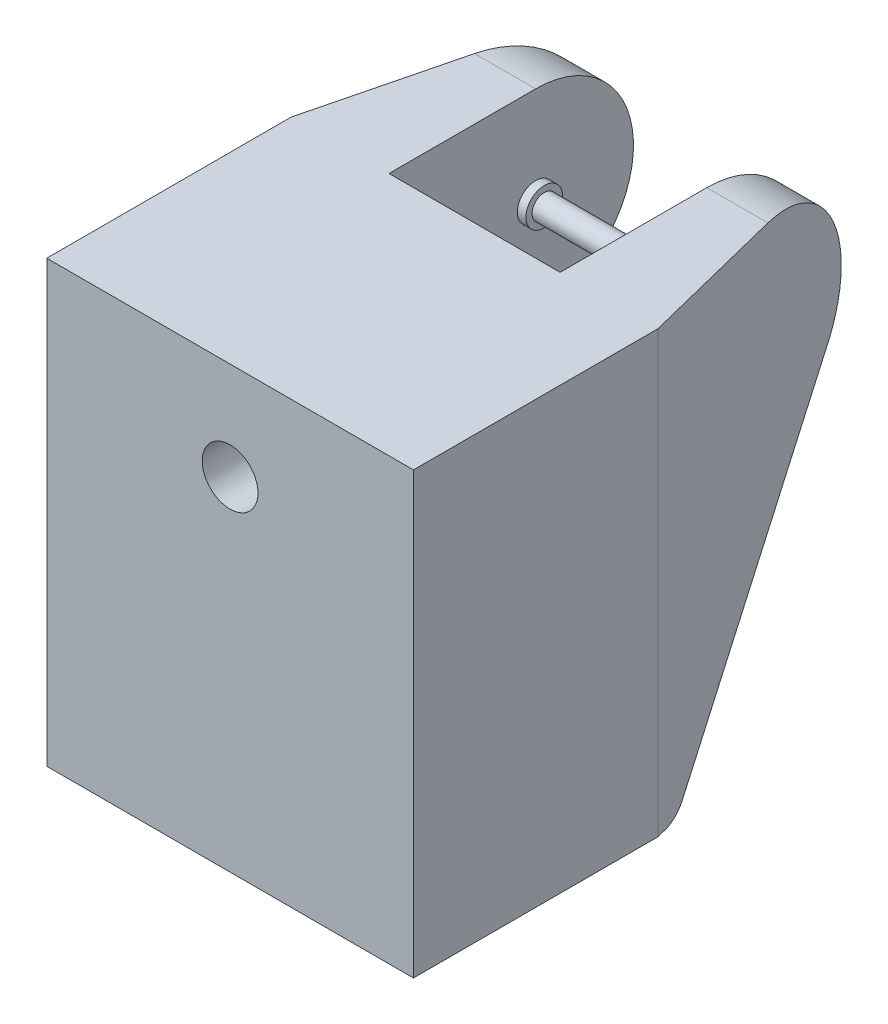
ISO-10303-21;
HEADER;
FILE_DESCRIPTION(('STEP AP214'),'2;1');
FILE_NAME('part.step','',(''),(''),'','','');
FILE_SCHEMA(('AUTOMOTIVE_DESIGN { 1 0 10303 214 1 1 1 1 }'));
ENDSEC;
DATA;
#1=APPLICATION_CONTEXT('core data for automotive mechanical design processes');
#2=APPLICATION_PROTOCOL_DEFINITION('international standard','automotive_design',2000,#1);
#3=PRODUCT_CONTEXT('',#1,'mechanical');
#4=PRODUCT('Part','Part','',(#3));
#5=PRODUCT_RELATED_PRODUCT_CATEGORY('part','',(#4));
#6=PRODUCT_DEFINITION_FORMATION('','',#4);
#7=PRODUCT_DEFINITION_CONTEXT('part definition',#1,'design');
#8=PRODUCT_DEFINITION('design','',#6,#7);
#9=PRODUCT_DEFINITION_SHAPE('','',#8);
#10=(LENGTH_UNIT() NAMED_UNIT(*) SI_UNIT(.MILLI.,.METRE.));
#11=(NAMED_UNIT(*) PLANE_ANGLE_UNIT() SI_UNIT($,.RADIAN.));
#12=(NAMED_UNIT(*) SI_UNIT($,.STERADIAN.) SOLID_ANGLE_UNIT());
#13=UNCERTAINTY_MEASURE_WITH_UNIT(LENGTH_MEASURE(1.E-05),#10,'distance_accuracy_value','');
#14=(GEOMETRIC_REPRESENTATION_CONTEXT(3) GLOBAL_UNCERTAINTY_ASSIGNED_CONTEXT((#13)) GLOBAL_UNIT_ASSIGNED_CONTEXT((#10,
#11,#12)) REPRESENTATION_CONTEXT('',''));
#15=CARTESIAN_POINT('',(0.,0.,0.));
#16=DIRECTION('',(0.,0.,1.));
#17=DIRECTION('',(1.,0.,0.));
#18=AXIS2_PLACEMENT_3D('',#15,#16,#17);
#19=CARTESIAN_POINT('',(35.,-138.,0.));
#20=DIRECTION('',(1.,0.,0.));
#21=DIRECTION('',(0.,0.,-1.));
#22=AXIS2_PLACEMENT_3D('',#19,#20,#21);
#23=PLANE('',#22);
#24=CARTESIAN_POINT('',(35.,-78.1073734186286,6.15734521899644));
#25=DIRECTION('',(-1.,0.,0.));
#26=DIRECTION('',(0.,0.,1.));
#27=AXIS2_PLACEMENT_3D('',#24,#25,#26);
#28=CIRCLE('',#27,11.9327184950051);
#29=CARTESIAN_POINT('',(35.,-85.77,-2.98999999999999));
#30=VERTEX_POINT('',#29);
#31=CARTESIAN_POINT('',(35.,-90.,5.18));
#32=VERTEX_POINT('',#31);
#33=EDGE_CURVE('E203',#30,#32,#28,.T.);
#34=ORIENTED_EDGE('',*,*,#33,.T.);
#35=DIRECTION('',(0.,0.,-1.));
#36=VECTOR('',#35,1.);
#37=CARTESIAN_POINT('',(34.9999999999999,-90.,110.));
#38=LINE('',#37,#36);
#39=CARTESIAN_POINT('',(35.,-90.,10.));
#40=VERTEX_POINT('',#39);
#41=EDGE_CURVE('E247',#40,#32,#38,.T.);
#42=ORIENTED_EDGE('',*,*,#41,.F.);
#43=DIRECTION('',(0.,1.,0.));
#44=VECTOR('',#43,1.);
#45=CARTESIAN_POINT('',(35.,-138.,10.));
#46=LINE('',#45,#44);
#47=CARTESIAN_POINT('',(35.,90.,10.));
#48=VERTEX_POINT('',#47);
#49=EDGE_CURVE('E243',#40,#48,#46,.T.);
#50=ORIENTED_EDGE('',*,*,#49,.T.);
#51=DIRECTION('',(0.,0.,-1.));
#52=VECTOR('',#51,1.);
#53=CARTESIAN_POINT('',(35.,90.,0.));
#54=LINE('',#53,#52);
#55=CARTESIAN_POINT('',(35.,90.,-50.));
#56=VERTEX_POINT('',#55);
#57=EDGE_CURVE('E237',#48,#56,#54,.T.);
#58=ORIENTED_EDGE('',*,*,#57,.T.);
#59=CARTESIAN_POINT('',(35.,50.,-50.));
#60=DIRECTION('',(1.,0.,0.));
#61=DIRECTION('',(0.,0.,-1.));
#62=AXIS2_PLACEMENT_3D('',#59,#60,#61);
#63=CIRCLE('',#62,40.);
#64=CARTESIAN_POINT('',(35.,26.9067801379938,-82.6604224774427));
#65=VERTEX_POINT('',#64);
#66=EDGE_CURVE('E217',#65,#56,#63,.T.);
#67=ORIENTED_EDGE('',*,*,#66,.F.);
#68=DIRECTION('',(0.,-0.816510561936067,0.577330496550155));
#69=VECTOR('',#68,1.);
#70=CARTESIAN_POINT('',(35.,-29.9975171577135,-42.4250749570505));
#71=LINE('',#70,#69);
#72=EDGE_CURVE('E296',#65,#30,#71,.T.);
#73=ORIENTED_EDGE('',*,*,#72,.T.);
#74=EDGE_LOOP('',(#34,#42,#50,#58,#67,#73));
#75=FACE_BOUND('',#74,.T.);
#76=CARTESIAN_POINT('',(35.,50.,-50.));
#77=DIRECTION('',(1.,0.,0.));
#78=DIRECTION('',(0.,0.,-1.));
#79=AXIS2_PLACEMENT_3D('',#76,#77,#78);
#80=CIRCLE('',#79,7.5);
#81=CARTESIAN_POINT('',(35.,50.,-57.5));
#82=VERTEX_POINT('',#81);
#83=EDGE_CURVE('E11',#82,#82,#80,.F.);
#84=ORIENTED_EDGE('',*,*,#83,.F.);
#85=EDGE_LOOP('',(#84));
#86=FACE_BOUND('',#85,.T.);
#87=ADVANCED_FACE('F40',(#75,#86),#23,.F.);
#88=CARTESIAN_POINT('',(-35.,-138.,0.));
#89=DIRECTION('',(1.,0.,0.));
#90=DIRECTION('',(0.,0.,-1.));
#91=AXIS2_PLACEMENT_3D('',#88,#89,#90);
#92=PLANE('',#91);
#93=CARTESIAN_POINT('',(-35.,-78.1073734186281,6.15734521899675));
#94=DIRECTION('',(-1.,0.,0.));
#95=DIRECTION('',(0.,0.,-1.));
#96=AXIS2_PLACEMENT_3D('',#93,#94,#95);
#97=CIRCLE('',#96,11.9327184950056);
#98=CARTESIAN_POINT('',(-35.,-85.77,-2.98999999999996));
#99=VERTEX_POINT('',#98);
#100=CARTESIAN_POINT('',(-35.,-90.,5.18000000000003));
#101=VERTEX_POINT('',#100);
#102=EDGE_CURVE('E283',#99,#101,#97,.T.);
#103=ORIENTED_EDGE('',*,*,#102,.F.);
#104=DIRECTION('',(0.,0.816510561936067,-0.577330496550155));
#105=VECTOR('',#104,1.);
#106=CARTESIAN_POINT('',(-35.,-29.9975171577135,-42.4250749570505));
#107=LINE('',#106,#105);
#108=CARTESIAN_POINT('',(-35.,26.9067801379938,-82.6604224774427));
#109=VERTEX_POINT('',#108);
#110=EDGE_CURVE('E212',#99,#109,#107,.T.);
#111=ORIENTED_EDGE('',*,*,#110,.T.);
#112=CARTESIAN_POINT('',(-35.,50.,-50.));
#113=DIRECTION('',(1.,0.,0.));
#114=DIRECTION('',(0.,0.,-1.));
#115=AXIS2_PLACEMENT_3D('',#112,#113,#114);
#116=CIRCLE('',#115,40.);
#117=CARTESIAN_POINT('',(-35.,90.,-50.));
#118=VERTEX_POINT('',#117);
#119=EDGE_CURVE('E206',#109,#118,#116,.T.);
#120=ORIENTED_EDGE('',*,*,#119,.T.);
#121=DIRECTION('',(0.,0.,-1.));
#122=VECTOR('',#121,1.);
#123=CARTESIAN_POINT('',(-35.,90.,0.));
#124=LINE('',#123,#122);
#125=CARTESIAN_POINT('',(-35.,90.,10.));
#126=VERTEX_POINT('',#125);
#127=EDGE_CURVE('E240',#126,#118,#124,.T.);
#128=ORIENTED_EDGE('',*,*,#127,.F.);
#129=DIRECTION('',(0.,1.,0.));
#130=VECTOR('',#129,1.);
#131=CARTESIAN_POINT('',(-35.,-138.,10.));
#132=LINE('',#131,#130);
#133=CARTESIAN_POINT('',(-35.,-90.,10.));
#134=VERTEX_POINT('',#133);
#135=EDGE_CURVE('E244',#134,#126,#132,.T.);
#136=ORIENTED_EDGE('',*,*,#135,.F.);
#137=DIRECTION('',(0.,0.,-1.));
#138=VECTOR('',#137,1.);
#139=CARTESIAN_POINT('',(-35.,-90.,110.));
#140=LINE('',#139,#138);
#141=EDGE_CURVE('E253',#134,#101,#140,.T.);
#142=ORIENTED_EDGE('',*,*,#141,.T.);
#143=EDGE_LOOP('',(#103,#111,#120,#128,#136,#142));
#144=FACE_BOUND('',#143,.T.);
#145=CARTESIAN_POINT('',(-35.,50.,-50.));
#146=DIRECTION('',(1.,0.,0.));
#147=DIRECTION('',(0.,0.,-1.));
#148=AXIS2_PLACEMENT_3D('',#145,#146,#147);
#149=CIRCLE('',#148,7.5);
#150=CARTESIAN_POINT('',(-35.,50.,-57.5));
#151=VERTEX_POINT('',#150);
#152=EDGE_CURVE('E318',#151,#151,#149,.T.);
#153=ORIENTED_EDGE('',*,*,#152,.F.);
#154=EDGE_LOOP('',(#153));
#155=FACE_BOUND('',#154,.T.);
#156=ADVANCED_FACE('F339',(#144,#155),#92,.T.);
#157=CARTESIAN_POINT('',(-75.,-90.,110.));
#158=DIRECTION('',(0.,1.,0.));
#159=DIRECTION('',(0.,0.,1.));
#160=AXIS2_PLACEMENT_3D('',#157,#158,#159);
#161=PLANE('',#160);
#162=DIRECTION('',(-0.242535625036333,0.,0.970142500145332));
#163=VECTOR('',#162,1.);
#164=CARTESIAN_POINT('',(-98.5294117647059,-90.,104.117647058824));
#165=LINE('',#164,#163);
#166=CARTESIAN_POINT('',(-73.795,-90.,5.18000000000003));
#167=VERTEX_POINT('',#166);
#168=CARTESIAN_POINT('',(-75.,-90.,9.99999999999987));
#169=VERTEX_POINT('',#168);
#170=EDGE_CURVE('E147',#167,#169,#165,.T.);
#171=ORIENTED_EDGE('',*,*,#170,.F.);
#172=DIRECTION('',(1.,0.,0.));
#173=VECTOR('',#172,1.);
#174=CARTESIAN_POINT('',(-75.,-90.,5.18000000000003));
#175=LINE('',#174,#173);
#176=EDGE_CURVE('E290',#167,#101,#175,.T.);
#177=ORIENTED_EDGE('',*,*,#176,.T.);
#178=ORIENTED_EDGE('',*,*,#141,.F.);
#179=DIRECTION('',(1.,0.,0.));
#180=VECTOR('',#179,1.);
#181=CARTESIAN_POINT('',(-75.,-90.,9.99999999999999));
#182=LINE('',#181,#180);
#183=EDGE_CURVE('E173',#134,#40,#182,.T.);
#184=ORIENTED_EDGE('',*,*,#183,.T.);
#185=ORIENTED_EDGE('',*,*,#41,.T.);
#186=DIRECTION('',(-1.,0.,0.));
#187=VECTOR('',#186,1.);
#188=CARTESIAN_POINT('',(75.,-90.,5.18000000000003));
#189=LINE('',#188,#187);
#190=CARTESIAN_POINT('',(73.795,-90.,5.18000000000003));
#191=VERTEX_POINT('',#190);
#192=EDGE_CURVE('E278',#191,#32,#189,.T.);
#193=ORIENTED_EDGE('',*,*,#192,.F.);
#194=DIRECTION('',(0.242535625036333,0.,0.970142500145332));
#195=VECTOR('',#194,1.);
#196=CARTESIAN_POINT('',(89.7058823529412,-90.,68.8235294117647));
#197=LINE('',#196,#195);
#198=CARTESIAN_POINT('',(75.,-90.,10.));
#199=VERTEX_POINT('',#198);
#200=EDGE_CURVE('E56',#191,#199,#197,.T.);
#201=ORIENTED_EDGE('',*,*,#200,.T.);
#202=DIRECTION('',(0.,0.,-1.));
#203=VECTOR('',#202,1.);
#204=CARTESIAN_POINT('',(75.,-90.,110.));
#205=LINE('',#204,#203);
#206=CARTESIAN_POINT('',(75.,-90.,110.));
#207=VERTEX_POINT('',#206);
#208=EDGE_CURVE('E175',#207,#199,#205,.T.);
#209=ORIENTED_EDGE('',*,*,#208,.F.);
#210=DIRECTION('',(1.,0.,0.));
#211=VECTOR('',#210,1.);
#212=CARTESIAN_POINT('',(-75.,-90.,110.));
#213=LINE('',#212,#211);
#214=CARTESIAN_POINT('',(-75.,-90.,110.));
#215=VERTEX_POINT('',#214);
#216=EDGE_CURVE('E266',#215,#207,#213,.T.);
#217=ORIENTED_EDGE('',*,*,#216,.F.);
#218=DIRECTION('',(0.,0.,-1.));
#219=VECTOR('',#218,1.);
#220=CARTESIAN_POINT('',(-75.,-90.,110.));
#221=LINE('',#220,#219);
#222=EDGE_CURVE('E168',#215,#169,#221,.T.);
#223=ORIENTED_EDGE('',*,*,#222,.T.);
#224=EDGE_LOOP('',(#171,#177,#178,#184,#185,#193,#201,#209,#217,#223));
#225=FACE_BOUND('',#224,.T.);
#226=ADVANCED_FACE('F277',(#225),#161,.F.);
#227=CARTESIAN_POINT('',(-75.,90.,110.));
#228=DIRECTION('',(0.,-1.,0.));
#229=DIRECTION('',(0.,0.,-1.));
#230=AXIS2_PLACEMENT_3D('',#227,#228,#229);
#231=PLANE('',#230);
#232=DIRECTION('',(-0.242535625036333,0.,0.970142500145332));
#233=VECTOR('',#232,1.);
#234=CARTESIAN_POINT('',(-68.2352941176471,90.,-17.0588235294118));
#235=LINE('',#234,#233);
#236=CARTESIAN_POINT('',(-60.,90.,-50.));
#237=VERTEX_POINT('',#236);
#238=CARTESIAN_POINT('',(-75.,90.,9.99999999999987));
#239=VERTEX_POINT('',#238);
#240=EDGE_CURVE('E144',#237,#239,#235,.T.);
#241=ORIENTED_EDGE('',*,*,#240,.T.);
#242=DIRECTION('',(0.,0.,-1.));
#243=VECTOR('',#242,1.);
#244=CARTESIAN_POINT('',(-75.,90.,110.));
#245=LINE('',#244,#243);
#246=CARTESIAN_POINT('',(-75.,90.,110.));
#247=VERTEX_POINT('',#246);
#248=EDGE_CURVE('E157',#247,#239,#245,.T.);
#249=ORIENTED_EDGE('',*,*,#248,.F.);
#250=DIRECTION('',(-1.,0.,0.));
#251=VECTOR('',#250,1.);
#252=CARTESIAN_POINT('',(-75.,90.,110.));
#253=LINE('',#252,#251);
#254=CARTESIAN_POINT('',(75.,90.,110.));
#255=VERTEX_POINT('',#254);
#256=EDGE_CURVE('E261',#255,#247,#253,.T.);
#257=ORIENTED_EDGE('',*,*,#256,.F.);
#258=DIRECTION('',(0.,0.,-1.));
#259=VECTOR('',#258,1.);
#260=CARTESIAN_POINT('',(75.,90.,110.));
#261=LINE('',#260,#259);
#262=CARTESIAN_POINT('',(75.,90.,10.));
#263=VERTEX_POINT('',#262);
#264=EDGE_CURVE('E167',#255,#263,#261,.T.);
#265=ORIENTED_EDGE('',*,*,#264,.T.);
#266=DIRECTION('',(0.242535625036333,0.,0.970142500145332));
#267=VECTOR('',#266,1.);
#268=CARTESIAN_POINT('',(68.2352941176471,90.,-17.0588235294118));
#269=LINE('',#268,#267);
#270=CARTESIAN_POINT('',(60.,90.,-50.));
#271=VERTEX_POINT('',#270);
#272=EDGE_CURVE('E310',#271,#263,#269,.T.);
#273=ORIENTED_EDGE('',*,*,#272,.F.);
#274=DIRECTION('',(1.,0.,0.));
#275=VECTOR('',#274,1.);
#276=CARTESIAN_POINT('',(35.,90.,-50.));
#277=LINE('',#276,#275);
#278=EDGE_CURVE('E207',#56,#271,#277,.T.);
#279=ORIENTED_EDGE('',*,*,#278,.F.);
#280=ORIENTED_EDGE('',*,*,#57,.F.);
#281=DIRECTION('',(1.,0.,0.));
#282=VECTOR('',#281,1.);
#283=CARTESIAN_POINT('',(0.,90.,10.));
#284=LINE('',#283,#282);
#285=EDGE_CURVE('E228',#126,#48,#284,.T.);
#286=ORIENTED_EDGE('',*,*,#285,.F.);
#287=ORIENTED_EDGE('',*,*,#127,.T.);
#288=DIRECTION('',(1.,0.,0.));
#289=VECTOR('',#288,1.);
#290=CARTESIAN_POINT('',(-75.,90.,-50.));
#291=LINE('',#290,#289);
#292=EDGE_CURVE('E160',#237,#118,#291,.T.);
#293=ORIENTED_EDGE('',*,*,#292,.F.);
#294=EDGE_LOOP('',(#241,#249,#257,#265,#273,#279,#280,#286,#287,#293));
#295=FACE_BOUND('',#294,.T.);
#296=ADVANCED_FACE('F156',(#295),#231,.F.);
#297=CARTESIAN_POINT('',(-75.,-90.,110.));
#298=DIRECTION('',(1.,0.,0.));
#299=DIRECTION('',(0.,0.,-1.));
#300=AXIS2_PLACEMENT_3D('',#297,#298,#299);
#301=PLANE('',#300);
#302=DIRECTION('',(0.,1.,0.));
#303=VECTOR('',#302,1.);
#304=CARTESIAN_POINT('',(-75.,-97.0000000000001,9.99999999999987));
#305=LINE('',#304,#303);
#306=EDGE_CURVE('E141',#169,#239,#305,.T.);
#307=ORIENTED_EDGE('',*,*,#306,.F.);
#308=ORIENTED_EDGE('',*,*,#222,.F.);
#309=DIRECTION('',(0.,-1.,0.));
#310=VECTOR('',#309,1.);
#311=CARTESIAN_POINT('',(-75.,-90.,110.));
#312=LINE('',#311,#310);
#313=EDGE_CURVE('E165',#247,#215,#312,.T.);
#314=ORIENTED_EDGE('',*,*,#313,.F.);
#315=ORIENTED_EDGE('',*,*,#248,.T.);
#316=EDGE_LOOP('',(#307,#308,#314,#315));
#317=FACE_BOUND('',#316,.T.);
#318=ADVANCED_FACE('F164',(#317),#301,.F.);
#319=CARTESIAN_POINT('',(-75.,50.,-50.));
#320=DIRECTION('',(1.,0.,0.));
#321=DIRECTION('',(0.,0.,-1.));
#322=AXIS2_PLACEMENT_3D('',#319,#320,#321);
#323=CYLINDRICAL_SURFACE('',#322,40.);
#324=CARTESIAN_POINT('',(-60.,50.,-50.));
#325=DIRECTION('',(-0.970142500145332,0.,-0.242535625036333));
#326=DIRECTION('',(0.242535625036333,0.,-0.970142500145332));
#327=AXIS2_PLACEMENT_3D('',#324,#325,#326);
#328=ELLIPSE('',#327,41.2310562561766,40.);
#329=CARTESIAN_POINT('',(-51.8348943806393,26.9067801379938,-82.6604224774427));
#330=VERTEX_POINT('',#329);
#331=EDGE_CURVE('E323',#330,#237,#328,.F.);
#332=ORIENTED_EDGE('',*,*,#331,.T.);
#333=ORIENTED_EDGE('',*,*,#292,.T.);
#334=ORIENTED_EDGE('',*,*,#119,.F.);
#335=DIRECTION('',(1.,0.,0.));
#336=VECTOR('',#335,1.);
#337=CARTESIAN_POINT('',(-75.,26.9067801379938,-82.6604224774427));
#338=LINE('',#337,#336);
#339=EDGE_CURVE('E225',#330,#109,#338,.T.);
#340=ORIENTED_EDGE('',*,*,#339,.F.);
#341=EDGE_LOOP('',(#332,#333,#334,#340));
#342=FACE_BOUND('',#341,.T.);
#343=ADVANCED_FACE('F328',(#342),#323,.T.);
#344=CARTESIAN_POINT('',(-75.,-29.9975171577135,-42.4250749570505));
#345=DIRECTION('',(0.,-0.577330496550155,-0.816510561936067));
#346=DIRECTION('',(0.,0.816510561936067,-0.577330496550155));
#347=AXIS2_PLACEMENT_3D('',#344,#345,#346);
#348=PLANE('',#347);
#349=DIRECTION('',(1.,0.,0.));
#350=VECTOR('',#349,1.);
#351=CARTESIAN_POINT('',(-75.,-85.77,-2.99));
#352=LINE('',#351,#350);
#353=CARTESIAN_POINT('',(-71.7525,-85.77,-2.99));
#354=VERTEX_POINT('',#353);
#355=EDGE_CURVE('E229',#354,#99,#352,.T.);
#356=ORIENTED_EDGE('',*,*,#355,.F.);
#357=DIRECTION('',(0.142852350238778,0.808136438066852,-0.571409400955111));
#358=VECTOR('',#357,1.);
#359=CARTESIAN_POINT('',(-62.1611881865985,-31.5105597295748,-41.3552472536061));
#360=LINE('',#359,#358);
#361=EDGE_CURVE('E64',#354,#330,#360,.T.);
#362=ORIENTED_EDGE('',*,*,#361,.T.);
#363=ORIENTED_EDGE('',*,*,#339,.T.);
#364=ORIENTED_EDGE('',*,*,#110,.F.);
#365=EDGE_LOOP('',(#356,#362,#363,#364));
#366=FACE_BOUND('',#365,.T.);
#367=ADVANCED_FACE('F332',(#366),#348,.T.);
#368=CARTESIAN_POINT('',(-75.,-78.1073734186281,6.15734521899675));
#369=DIRECTION('',(1.,0.,0.));
#370=DIRECTION('',(0.,0.,-1.));
#371=AXIS2_PLACEMENT_3D('',#368,#369,#370);
#372=CYLINDRICAL_SURFACE('',#371,11.9327184950056);
#373=CARTESIAN_POINT('',(-74.0393363047492,-78.1073734186281,6.15734521899675));
#374=DIRECTION('',(-0.970142500145332,0.,-0.242535625036333));
#375=DIRECTION('',(0.242535625036333,0.,-0.970142500145332));
#376=AXIS2_PLACEMENT_3D('',#373,#374,#375);
#377=ELLIPSE('',#376,12.2999646889174,11.9327184950056);
#378=EDGE_CURVE('E182',#354,#167,#377,.T.);
#379=ORIENTED_EDGE('',*,*,#378,.F.);
#380=ORIENTED_EDGE('',*,*,#355,.T.);
#381=ORIENTED_EDGE('',*,*,#102,.T.);
#382=ORIENTED_EDGE('',*,*,#176,.F.);
#383=EDGE_LOOP('',(#379,#380,#381,#382));
#384=FACE_BOUND('',#383,.T.);
#385=ADVANCED_FACE('F336',(#384),#372,.T.);
#386=CARTESIAN_POINT('',(75.,-90.,110.));
#387=DIRECTION('',(-1.,0.,0.));
#388=DIRECTION('',(0.,0.,1.));
#389=AXIS2_PLACEMENT_3D('',#386,#387,#388);
#390=PLANE('',#389);
#391=ORIENTED_EDGE('',*,*,#208,.T.);
#392=DIRECTION('',(0.,1.,0.));
#393=VECTOR('',#392,1.);
#394=CARTESIAN_POINT('',(75.,-97.0000000000001,10.));
#395=LINE('',#394,#393);
#396=EDGE_CURVE('E162',#199,#263,#395,.T.);
#397=ORIENTED_EDGE('',*,*,#396,.T.);
#398=ORIENTED_EDGE('',*,*,#264,.F.);
#399=DIRECTION('',(0.,1.,0.));
#400=VECTOR('',#399,1.);
#401=CARTESIAN_POINT('',(75.,-90.,110.));
#402=LINE('',#401,#400);
#403=EDGE_CURVE('E257',#207,#255,#402,.T.);
#404=ORIENTED_EDGE('',*,*,#403,.F.);
#405=EDGE_LOOP('',(#391,#397,#398,#404));
#406=FACE_BOUND('',#405,.T.);
#407=ADVANCED_FACE('F42',(#406),#390,.F.);
#408=CARTESIAN_POINT('',(0.,0.,110.));
#409=DIRECTION('',(0.,0.,-1.));
#410=DIRECTION('',(-1.,0.,0.));
#411=AXIS2_PLACEMENT_3D('',#408,#409,#410);
#412=PLANE('',#411);
#413=CARTESIAN_POINT('',(0.,50.,110.));
#414=DIRECTION('',(0.,0.,1.));
#415=DIRECTION('',(1.,0.,0.));
#416=AXIS2_PLACEMENT_3D('',#413,#414,#415);
#417=CIRCLE('',#416,11.405);
#418=CARTESIAN_POINT('',(11.405,50.,110.));
#419=VERTEX_POINT('',#418);
#420=EDGE_CURVE('E411',#419,#419,#417,.T.);
#421=ORIENTED_EDGE('',*,*,#420,.F.);
#422=EDGE_LOOP('',(#421));
#423=FACE_BOUND('',#422,.T.);
#424=ORIENTED_EDGE('',*,*,#403,.T.);
#425=ORIENTED_EDGE('',*,*,#256,.T.);
#426=ORIENTED_EDGE('',*,*,#313,.T.);
#427=ORIENTED_EDGE('',*,*,#216,.T.);
#428=EDGE_LOOP('',(#424,#425,#426,#427));
#429=FACE_BOUND('',#428,.T.);
#430=ADVANCED_FACE('F347',(#423,#429),#412,.F.);
#431=CARTESIAN_POINT('',(0.,-138.,10.));
#432=DIRECTION('',(0.,0.,1.));
#433=DIRECTION('',(1.,0.,0.));
#434=AXIS2_PLACEMENT_3D('',#431,#432,#433);
#435=PLANE('',#434);
#436=ORIENTED_EDGE('',*,*,#135,.T.);
#437=ORIENTED_EDGE('',*,*,#285,.T.);
#438=ORIENTED_EDGE('',*,*,#49,.F.);
#439=ORIENTED_EDGE('',*,*,#183,.F.);
#440=EDGE_LOOP('',(#436,#437,#438,#439));
#441=FACE_BOUND('',#440,.T.);
#442=ADVANCED_FACE('F345',(#441),#435,.F.);
#443=CARTESIAN_POINT('',(35.,-29.9975171577135,-42.4250749570505));
#444=DIRECTION('',(0.,0.577330496550155,0.816510561936067));
#445=DIRECTION('',(0.,-0.816510561936067,0.577330496550155));
#446=AXIS2_PLACEMENT_3D('',#443,#444,#445);
#447=PLANE('',#446);
#448=DIRECTION('',(1.,0.,0.));
#449=VECTOR('',#448,1.);
#450=CARTESIAN_POINT('',(35.,26.9067801379938,-82.6604224774427));
#451=LINE('',#450,#449);
#452=CARTESIAN_POINT('',(51.8348943806393,26.9067801379938,-82.6604224774427));
#453=VERTEX_POINT('',#452);
#454=EDGE_CURVE('E198',#65,#453,#451,.T.);
#455=ORIENTED_EDGE('',*,*,#454,.T.);
#456=DIRECTION('',(0.142852350238778,-0.808136438066852,0.571409400955111));
#457=VECTOR('',#456,1.);
#458=CARTESIAN_POINT('',(61.3449164278488,-26.892792149917,-44.6203342886049));
#459=LINE('',#458,#457);
#460=CARTESIAN_POINT('',(71.7525,-85.77,-2.98999999999999));
#461=VERTEX_POINT('',#460);
#462=EDGE_CURVE('E188',#453,#461,#459,.T.);
#463=ORIENTED_EDGE('',*,*,#462,.T.);
#464=DIRECTION('',(1.,0.,0.));
#465=VECTOR('',#464,1.);
#466=CARTESIAN_POINT('',(35.,-85.77,-2.98999999999999));
#467=LINE('',#466,#465);
#468=EDGE_CURVE('E197',#30,#461,#467,.T.);
#469=ORIENTED_EDGE('',*,*,#468,.F.);
#470=ORIENTED_EDGE('',*,*,#72,.F.);
#471=EDGE_LOOP('',(#455,#463,#469,#470));
#472=FACE_BOUND('',#471,.T.);
#473=ADVANCED_FACE('F195',(#472),#447,.F.);
#474=CARTESIAN_POINT('',(35.,50.,-50.));
#475=DIRECTION('',(1.,0.,0.));
#476=DIRECTION('',(0.,0.,-1.));
#477=AXIS2_PLACEMENT_3D('',#474,#475,#476);
#478=CYLINDRICAL_SURFACE('',#477,40.);
#479=CARTESIAN_POINT('',(60.,50.,-50.));
#480=DIRECTION('',(-0.970142500145332,0.,0.242535625036333));
#481=DIRECTION('',(0.242535625036333,0.,0.970142500145332));
#482=AXIS2_PLACEMENT_3D('',#479,#480,#481);
#483=ELLIPSE('',#482,41.2310562561766,40.);
#484=EDGE_CURVE('E280',#453,#271,#483,.F.);
#485=ORIENTED_EDGE('',*,*,#484,.F.);
#486=ORIENTED_EDGE('',*,*,#454,.F.);
#487=ORIENTED_EDGE('',*,*,#66,.T.);
#488=ORIENTED_EDGE('',*,*,#278,.T.);
#489=EDGE_LOOP('',(#485,#486,#487,#488));
#490=FACE_BOUND('',#489,.T.);
#491=ADVANCED_FACE('F303',(#490),#478,.T.);
#492=CARTESIAN_POINT('',(75.,-78.1073734186286,6.15734521899646));
#493=DIRECTION('',(-1.,0.,0.));
#494=DIRECTION('',(0.,0.,1.));
#495=AXIS2_PLACEMENT_3D('',#492,#493,#494);
#496=CYLINDRICAL_SURFACE('',#495,11.9327184950051);
#497=CARTESIAN_POINT('',(74.0393363047491,-78.1073734186286,6.15734521899646));
#498=DIRECTION('',(-0.970142500145332,0.,0.242535625036333));
#499=DIRECTION('',(-0.242535625036333,0.,-0.970142500145332));
#500=AXIS2_PLACEMENT_3D('',#497,#498,#499);
#501=ELLIPSE('',#500,12.2999646889168,11.9327184950051);
#502=EDGE_CURVE('E49',#191,#461,#501,.F.);
#503=ORIENTED_EDGE('',*,*,#502,.F.);
#504=ORIENTED_EDGE('',*,*,#192,.T.);
#505=ORIENTED_EDGE('',*,*,#33,.F.);
#506=ORIENTED_EDGE('',*,*,#468,.T.);
#507=EDGE_LOOP('',(#503,#504,#505,#506));
#508=FACE_BOUND('',#507,.T.);
#509=ADVANCED_FACE('F201',(#508),#496,.T.);
#510=CARTESIAN_POINT('',(-68.2352941176471,-97.0000000000001,-17.0588235294118));
#511=DIRECTION('',(-0.970142500145332,0.,-0.242535625036333));
#512=DIRECTION('',(-0.242535625036333,0.,0.970142500145332));
#513=AXIS2_PLACEMENT_3D('',#510,#511,#512);
#514=PLANE('',#513);
#515=ORIENTED_EDGE('',*,*,#170,.T.);
#516=ORIENTED_EDGE('',*,*,#306,.T.);
#517=ORIENTED_EDGE('',*,*,#240,.F.);
#518=ORIENTED_EDGE('',*,*,#331,.F.);
#519=ORIENTED_EDGE('',*,*,#361,.F.);
#520=ORIENTED_EDGE('',*,*,#378,.T.);
#521=EDGE_LOOP('',(#515,#516,#517,#518,#519,#520));
#522=FACE_BOUND('',#521,.T.);
#523=ADVANCED_FACE('F143',(#522),#514,.T.);
#524=CARTESIAN_POINT('',(68.2352941176471,-97.0000000000001,-17.0588235294118));
#525=DIRECTION('',(-0.970142500145332,0.,0.242535625036333));
#526=DIRECTION('',(0.242535625036333,0.,0.970142500145332));
#527=AXIS2_PLACEMENT_3D('',#524,#525,#526);
#528=PLANE('',#527);
#529=ORIENTED_EDGE('',*,*,#484,.T.);
#530=ORIENTED_EDGE('',*,*,#272,.T.);
#531=ORIENTED_EDGE('',*,*,#396,.F.);
#532=ORIENTED_EDGE('',*,*,#200,.F.);
#533=ORIENTED_EDGE('',*,*,#502,.T.);
#534=ORIENTED_EDGE('',*,*,#462,.F.);
#535=EDGE_LOOP('',(#529,#530,#531,#532,#533,#534));
#536=FACE_BOUND('',#535,.T.);
#537=ADVANCED_FACE('F187',(#536),#528,.F.);
#538=CARTESIAN_POINT('',(59.142135623731,50.,-50.));
#539=DIRECTION('',(-1.,0.,0.));
#540=DIRECTION('',(0.,0.,1.));
#541=AXIS2_PLACEMENT_3D('',#538,#539,#540);
#542=CYLINDRICAL_SURFACE('',#541,5.);
#543=CARTESIAN_POINT('',(31.5,50.,-50.));
#544=DIRECTION('',(-1.,0.,0.));
#545=DIRECTION('',(0.,0.,1.));
#546=AXIS2_PLACEMENT_3D('',#543,#544,#545);
#547=CIRCLE('',#546,5.);
#548=CARTESIAN_POINT('',(31.5,50.,-45.));
#549=VERTEX_POINT('',#548);
#550=EDGE_CURVE('E410',#549,#549,#547,.T.);
#551=ORIENTED_EDGE('',*,*,#550,.T.);
#552=EDGE_LOOP('',(#551));
#553=FACE_BOUND('',#552,.T.);
#554=CARTESIAN_POINT('',(-31.5,50.,-50.));
#555=DIRECTION('',(1.,0.,0.));
#556=DIRECTION('',(0.,0.,-1.));
#557=AXIS2_PLACEMENT_3D('',#554,#555,#556);
#558=CIRCLE('',#557,5.);
#559=CARTESIAN_POINT('',(-31.5,50.,-55.));
#560=VERTEX_POINT('',#559);
#561=EDGE_CURVE('E424',#560,#560,#558,.T.);
#562=ORIENTED_EDGE('',*,*,#561,.T.);
#563=EDGE_LOOP('',(#562));
#564=FACE_BOUND('',#563,.T.);
#565=ADVANCED_FACE('F375',(#553,#564),#542,.T.);
#566=CARTESIAN_POINT('',(-31.5,50.,-50.));
#567=DIRECTION('',(1.,0.,0.));
#568=DIRECTION('',(0.,0.,-1.));
#569=AXIS2_PLACEMENT_3D('',#566,#567,#568);
#570=PLANE('',#569);
#571=CARTESIAN_POINT('',(-31.5,50.,-50.));
#572=DIRECTION('',(1.,0.,0.));
#573=DIRECTION('',(0.,0.,-1.));
#574=AXIS2_PLACEMENT_3D('',#571,#572,#573);
#575=CIRCLE('',#574,7.5);
#576=CARTESIAN_POINT('',(-31.5,50.,-57.5));
#577=VERTEX_POINT('',#576);
#578=EDGE_CURVE('E312',#577,#577,#575,.T.);
#579=ORIENTED_EDGE('',*,*,#578,.T.);
#580=EDGE_LOOP('',(#579));
#581=FACE_BOUND('',#580,.T.);
#582=ORIENTED_EDGE('',*,*,#561,.F.);
#583=EDGE_LOOP('',(#582));
#584=FACE_BOUND('',#583,.T.);
#585=ADVANCED_FACE('F380',(#581,#584),#570,.T.);
#586=CARTESIAN_POINT('',(-31.5,50.,-50.));
#587=DIRECTION('',(-1.,0.,0.));
#588=DIRECTION('',(0.,0.,1.));
#589=AXIS2_PLACEMENT_3D('',#586,#587,#588);
#590=CYLINDRICAL_SURFACE('',#589,7.5);
#591=ORIENTED_EDGE('',*,*,#578,.F.);
#592=EDGE_LOOP('',(#591));
#593=FACE_BOUND('',#592,.T.);
#594=ORIENTED_EDGE('',*,*,#152,.T.);
#595=EDGE_LOOP('',(#594));
#596=FACE_BOUND('',#595,.T.);
#597=ADVANCED_FACE('F382',(#593,#596),#590,.T.);
#598=CARTESIAN_POINT('',(31.5,50.,-50.));
#599=DIRECTION('',(-1.,0.,0.));
#600=DIRECTION('',(0.,0.,1.));
#601=AXIS2_PLACEMENT_3D('',#598,#599,#600);
#602=PLANE('',#601);
#603=CARTESIAN_POINT('',(31.5,50.,-50.));
#604=DIRECTION('',(-1.,0.,0.));
#605=DIRECTION('',(0.,0.,1.));
#606=AXIS2_PLACEMENT_3D('',#603,#604,#605);
#607=CIRCLE('',#606,7.5);
#608=CARTESIAN_POINT('',(31.5,50.,-42.5));
#609=VERTEX_POINT('',#608);
#610=EDGE_CURVE('E416',#609,#609,#607,.T.);
#611=ORIENTED_EDGE('',*,*,#610,.T.);
#612=EDGE_LOOP('',(#611));
#613=FACE_BOUND('',#612,.T.);
#614=ORIENTED_EDGE('',*,*,#550,.F.);
#615=EDGE_LOOP('',(#614));
#616=FACE_BOUND('',#615,.T.);
#617=ADVANCED_FACE('F385',(#613,#616),#602,.T.);
#618=CARTESIAN_POINT('',(31.5,50.,-50.));
#619=DIRECTION('',(1.,0.,0.));
#620=DIRECTION('',(0.,0.,-1.));
#621=AXIS2_PLACEMENT_3D('',#618,#619,#620);
#622=CYLINDRICAL_SURFACE('',#621,7.5);
#623=ORIENTED_EDGE('',*,*,#610,.F.);
#624=EDGE_LOOP('',(#623));
#625=FACE_BOUND('',#624,.T.);
#626=ORIENTED_EDGE('',*,*,#83,.T.);
#627=EDGE_LOOP('',(#626));
#628=FACE_BOUND('',#627,.T.);
#629=ADVANCED_FACE('F390',(#625,#628),#622,.T.);
#630=CARTESIAN_POINT('',(0.,50.,90.));
#631=DIRECTION('',(0.,0.,1.));
#632=DIRECTION('',(1.,0.,0.));
#633=AXIS2_PLACEMENT_3D('',#630,#631,#632);
#634=CYLINDRICAL_SURFACE('',#633,11.405);
#635=CARTESIAN_POINT('',(0.,50.,90.));
#636=DIRECTION('',(0.,0.,1.));
#637=DIRECTION('',(1.,0.,0.));
#638=AXIS2_PLACEMENT_3D('',#635,#636,#637);
#639=CIRCLE('',#638,11.405);
#640=CARTESIAN_POINT('',(11.405,50.,90.));
#641=VERTEX_POINT('',#640);
#642=EDGE_CURVE('E408',#641,#641,#639,.T.);
#643=ORIENTED_EDGE('',*,*,#642,.F.);
#644=EDGE_LOOP('',(#643));
#645=FACE_BOUND('',#644,.T.);
#646=ORIENTED_EDGE('',*,*,#420,.T.);
#647=EDGE_LOOP('',(#646));
#648=FACE_BOUND('',#647,.T.);
#649=ADVANCED_FACE('F393',(#645,#648),#634,.F.);
#650=CARTESIAN_POINT('',(0.,0.,90.));
#651=DIRECTION('',(0.,0.,1.));
#652=DIRECTION('',(1.,0.,0.));
#653=AXIS2_PLACEMENT_3D('',#650,#651,#652);
#654=PLANE('',#653);
#655=ORIENTED_EDGE('',*,*,#642,.T.);
#656=EDGE_LOOP('',(#655));
#657=FACE_BOUND('',#656,.T.);
#658=ADVANCED_FACE('F400',(#657),#654,.T.);
#659=CLOSED_SHELL('',(#87,#156,#226,#296,#318,#343,#367,#385,#407,#430,#442,#473,#491,#509,#523,
#537,#565,#585,#597,#617,#629,#649,#658));
#660=MANIFOLD_SOLID_BREP('B2',#659);
#661=ADVANCED_BREP_SHAPE_REPRESENTATION('',(#18,#660),#14);
#662=SHAPE_DEFINITION_REPRESENTATION(#9,#661);
ENDSEC;
END-ISO-10303-21;
